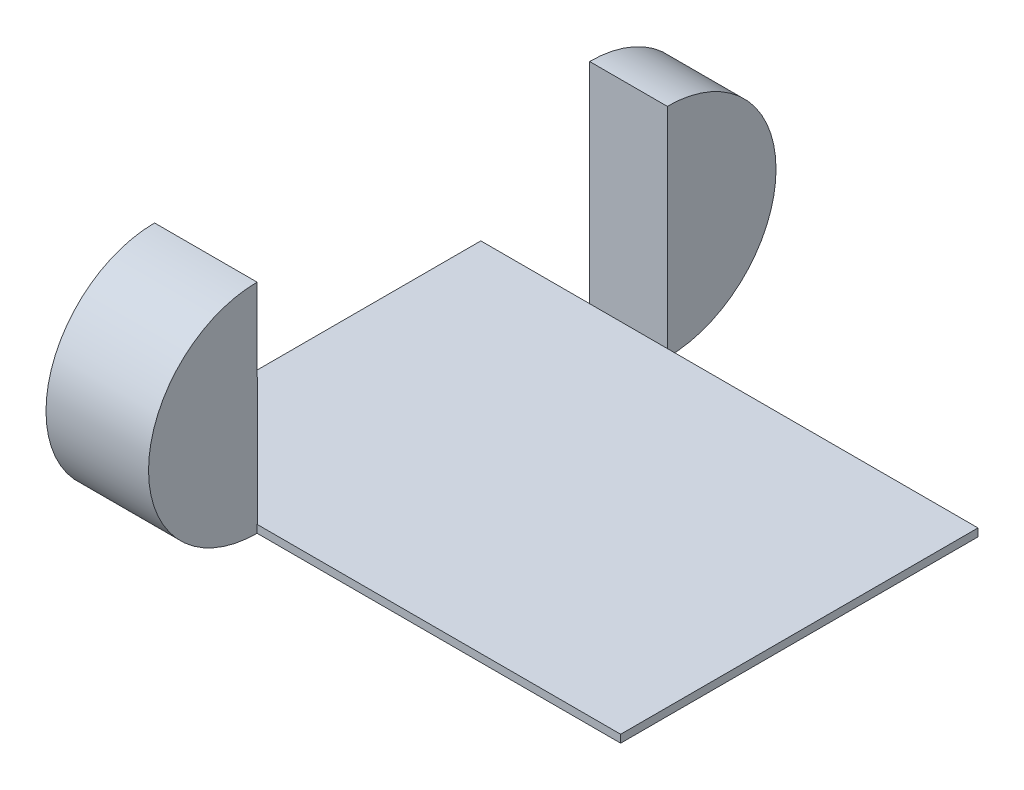
ISO-10303-21;
HEADER;
FILE_DESCRIPTION(('STEP AP214'),'2;1');
FILE_NAME('part.step','',(''),(''),'','','');
FILE_SCHEMA(('AUTOMOTIVE_DESIGN { 1 0 10303 214 1 1 1 1 }'));
ENDSEC;
DATA;
#1=APPLICATION_CONTEXT('core data for automotive mechanical design processes');
#2=APPLICATION_PROTOCOL_DEFINITION('international standard','automotive_design',2000,#1);
#3=PRODUCT_CONTEXT('',#1,'mechanical');
#4=PRODUCT('Part','Part','',(#3));
#5=PRODUCT_RELATED_PRODUCT_CATEGORY('part','',(#4));
#6=PRODUCT_DEFINITION_FORMATION('','',#4);
#7=PRODUCT_DEFINITION_CONTEXT('part definition',#1,'design');
#8=PRODUCT_DEFINITION('design','',#6,#7);
#9=PRODUCT_DEFINITION_SHAPE('','',#8);
#10=(LENGTH_UNIT() NAMED_UNIT(*) SI_UNIT(.MILLI.,.METRE.));
#11=(NAMED_UNIT(*) PLANE_ANGLE_UNIT() SI_UNIT($,.RADIAN.));
#12=(NAMED_UNIT(*) SI_UNIT($,.STERADIAN.) SOLID_ANGLE_UNIT());
#13=UNCERTAINTY_MEASURE_WITH_UNIT(LENGTH_MEASURE(1.E-05),#10,'distance_accuracy_value','');
#14=(GEOMETRIC_REPRESENTATION_CONTEXT(3) GLOBAL_UNCERTAINTY_ASSIGNED_CONTEXT((#13)) GLOBAL_UNIT_ASSIGNED_CONTEXT((#10,
#11,#12)) REPRESENTATION_CONTEXT('',''));
#15=CARTESIAN_POINT('',(0.,0.,0.));
#16=DIRECTION('',(0.,0.,1.));
#17=DIRECTION('',(1.,0.,0.));
#18=AXIS2_PLACEMENT_3D('',#15,#16,#17);
#19=CARTESIAN_POINT('',(-16.,0.5,11.5));
#20=DIRECTION('',(0.,0.,-1.));
#21=DIRECTION('',(-1.,0.,0.));
#22=AXIS2_PLACEMENT_3D('',#19,#20,#21);
#23=PLANE('',#22);
#24=DIRECTION('',(0.,1.,0.));
#25=VECTOR('',#24,1.);
#26=CARTESIAN_POINT('',(-7.39999999999999,0.5,11.5));
#27=LINE('',#26,#25);
#28=CARTESIAN_POINT('',(-7.39999999999999,0.,11.4999999999998));
#29=VERTEX_POINT('',#28);
#30=CARTESIAN_POINT('',(-7.39999999999999,0.5,11.5));
#31=VERTEX_POINT('',#30);
#32=EDGE_CURVE('E168',#29,#31,#27,.T.);
#33=ORIENTED_EDGE('',*,*,#32,.F.);
#34=DIRECTION('',(1.,0.,0.));
#35=VECTOR('',#34,1.);
#36=CARTESIAN_POINT('',(-16.,0.,11.5));
#37=LINE('',#36,#35);
#38=CARTESIAN_POINT('',(16.,0.,11.5));
#39=VERTEX_POINT('',#38);
#40=EDGE_CURVE('E41',#29,#39,#37,.T.);
#41=ORIENTED_EDGE('',*,*,#40,.T.);
#42=DIRECTION('',(0.,-1.,0.));
#43=VECTOR('',#42,1.);
#44=CARTESIAN_POINT('',(16.,0.5,11.5));
#45=LINE('',#44,#43);
#46=CARTESIAN_POINT('',(16.,0.5,11.5));
#47=VERTEX_POINT('',#46);
#48=EDGE_CURVE('E230',#47,#39,#45,.T.);
#49=ORIENTED_EDGE('',*,*,#48,.F.);
#50=DIRECTION('',(1.,0.,0.));
#51=VECTOR('',#50,1.);
#52=CARTESIAN_POINT('',(-16.,0.5,11.5));
#53=LINE('',#52,#51);
#54=EDGE_CURVE('E226',#31,#47,#53,.T.);
#55=ORIENTED_EDGE('',*,*,#54,.F.);
#56=EDGE_LOOP('',(#33,#41,#49,#55));
#57=FACE_BOUND('',#56,.T.);
#58=ADVANCED_FACE('F37',(#57),#23,.F.);
#59=CARTESIAN_POINT('',(0.,0.5,0.));
#60=DIRECTION('',(0.,1.,0.));
#61=DIRECTION('',(0.,0.,1.));
#62=AXIS2_PLACEMENT_3D('',#59,#60,#61);
#63=PLANE('',#62);
#64=DIRECTION('',(-1.,0.,0.));
#65=VECTOR('',#64,1.);
#66=CARTESIAN_POINT('',(0.,0.5,11.4742724279794));
#67=LINE('',#66,#65);
#68=CARTESIAN_POINT('',(-7.39999999999999,0.5,11.4742724279794));
#69=VERTEX_POINT('',#68);
#70=CARTESIAN_POINT('',(-14.,0.5,11.4742724279794));
#71=VERTEX_POINT('',#70);
#72=EDGE_CURVE('E205',#69,#71,#67,.T.);
#73=ORIENTED_EDGE('',*,*,#72,.F.);
#74=DIRECTION('',(0.,0.,1.));
#75=VECTOR('',#74,1.);
#76=CARTESIAN_POINT('',(-7.4,0.5,0.));
#77=LINE('',#76,#75);
#78=EDGE_CURVE('E148',#69,#31,#77,.T.);
#79=ORIENTED_EDGE('',*,*,#78,.T.);
#80=ORIENTED_EDGE('',*,*,#54,.T.);
#81=DIRECTION('',(0.,0.,-1.));
#82=VECTOR('',#81,1.);
#83=CARTESIAN_POINT('',(16.,0.5,-11.5));
#84=LINE('',#83,#82);
#85=CARTESIAN_POINT('',(16.,0.5,-11.5));
#86=VERTEX_POINT('',#85);
#87=EDGE_CURVE('E217',#47,#86,#84,.T.);
#88=ORIENTED_EDGE('',*,*,#87,.T.);
#89=DIRECTION('',(-1.,0.,0.));
#90=VECTOR('',#89,1.);
#91=CARTESIAN_POINT('',(-16.,0.5,-11.5));
#92=LINE('',#91,#90);
#93=CARTESIAN_POINT('',(-4.,0.5,-11.5));
#94=VERTEX_POINT('',#93);
#95=EDGE_CURVE('E221',#86,#94,#92,.T.);
#96=ORIENTED_EDGE('',*,*,#95,.T.);
#97=DIRECTION('',(1.,0.,0.));
#98=VECTOR('',#97,1.);
#99=CARTESIAN_POINT('',(0.,0.5,-11.5));
#100=LINE('',#99,#98);
#101=CARTESIAN_POINT('',(-9.,0.5,-11.5));
#102=VERTEX_POINT('',#101);
#103=EDGE_CURVE('E211',#102,#94,#100,.T.);
#104=ORIENTED_EDGE('',*,*,#103,.F.);
#105=CARTESIAN_POINT('',(-16.,0.5,-11.5));
#106=VERTEX_POINT('',#105);
#107=EDGE_CURVE('E62',#102,#106,#92,.T.);
#108=ORIENTED_EDGE('',*,*,#107,.T.);
#109=DIRECTION('',(0.,0.,1.));
#110=VECTOR('',#109,1.);
#111=CARTESIAN_POINT('',(-16.,0.5,-11.5));
#112=LINE('',#111,#110);
#113=CARTESIAN_POINT('',(-16.,0.5,11.5));
#114=VERTEX_POINT('',#113);
#115=EDGE_CURVE('E224',#106,#114,#112,.T.);
#116=ORIENTED_EDGE('',*,*,#115,.T.);
#117=CARTESIAN_POINT('',(-14.,0.5,11.5));
#118=VERTEX_POINT('',#117);
#119=EDGE_CURVE('E227',#114,#118,#53,.T.);
#120=ORIENTED_EDGE('',*,*,#119,.T.);
#121=DIRECTION('',(0.,0.,1.));
#122=VECTOR('',#121,1.);
#123=CARTESIAN_POINT('',(-14.,0.5,0.));
#124=LINE('',#123,#122);
#125=EDGE_CURVE('E294',#71,#118,#124,.T.);
#126=ORIENTED_EDGE('',*,*,#125,.F.);
#127=EDGE_LOOP('',(#73,#79,#80,#88,#96,#104,#108,#116,#120,#126));
#128=FACE_BOUND('',#127,.T.);
#129=ADVANCED_FACE('F266',(#128),#63,.T.);
#130=CARTESIAN_POINT('',(0.,0.,0.));
#131=DIRECTION('',(0.,1.,0.));
#132=DIRECTION('',(0.,0.,1.));
#133=AXIS2_PLACEMENT_3D('',#130,#131,#132);
#134=PLANE('',#133);
#135=CARTESIAN_POINT('',(-7.39999999999999,6.99998728845041,11.4866597765736));
#136=DIRECTION('',(-1.,0.,0.));
#137=DIRECTION('',(0.,-0.999998184064055,-0.0019057462037765));
#138=AXIS2_PLACEMENT_3D('',#135,#136,#137);
#139=CIRCLE('',#138,7.00000000000202);
#140=CARTESIAN_POINT('',(-7.39999999999999,0.,11.4733195531471));
#141=VERTEX_POINT('',#140);
#142=EDGE_CURVE('E11',#141,#29,#139,.T.);
#143=ORIENTED_EDGE('',*,*,#142,.F.);
#144=DIRECTION('',(-1.,0.,0.));
#145=VECTOR('',#144,1.);
#146=CARTESIAN_POINT('',(-7.39999999999999,0.,11.4733195531471));
#147=LINE('',#146,#145);
#148=CARTESIAN_POINT('',(-14.,0.,11.4733195531471));
#149=VERTEX_POINT('',#148);
#150=EDGE_CURVE('E144',#141,#149,#147,.T.);
#151=ORIENTED_EDGE('',*,*,#150,.T.);
#152=CARTESIAN_POINT('',(-14.,0.,11.4733195531471));
#153=DIRECTION('',(0.,0.,1.));
#154=VECTOR('',#153,1.);
#155=LINE('',#152,#154);
#156=CARTESIAN_POINT('',(-14.,0.,11.5));
#157=VERTEX_POINT('',#156);
#158=EDGE_CURVE('E47',#149,#157,#155,.T.);
#159=ORIENTED_EDGE('',*,*,#158,.T.);
#160=CARTESIAN_POINT('',(-16.,0.,11.5));
#161=VERTEX_POINT('',#160);
#162=EDGE_CURVE('E220',#161,#157,#37,.T.);
#163=ORIENTED_EDGE('',*,*,#162,.F.);
#164=DIRECTION('',(0.,0.,1.));
#165=VECTOR('',#164,1.);
#166=CARTESIAN_POINT('',(-16.,0.,-11.5));
#167=LINE('',#166,#165);
#168=CARTESIAN_POINT('',(-16.,0.,-11.5));
#169=VERTEX_POINT('',#168);
#170=EDGE_CURVE('E237',#169,#161,#167,.T.);
#171=ORIENTED_EDGE('',*,*,#170,.F.);
#172=DIRECTION('',(-1.,0.,0.));
#173=VECTOR('',#172,1.);
#174=CARTESIAN_POINT('',(-16.,0.,-11.5));
#175=LINE('',#174,#173);
#176=CARTESIAN_POINT('',(-9.,0.,-11.5));
#177=VERTEX_POINT('',#176);
#178=EDGE_CURVE('E233',#177,#169,#175,.T.);
#179=ORIENTED_EDGE('',*,*,#178,.F.);
#180=DIRECTION('',(-1.,0.,0.));
#181=VECTOR('',#180,1.);
#182=CARTESIAN_POINT('',(-4.,0.,-11.5));
#183=LINE('',#182,#181);
#184=CARTESIAN_POINT('',(-4.,0.,-11.5));
#185=VERTEX_POINT('',#184);
#186=EDGE_CURVE('E200',#185,#177,#183,.T.);
#187=ORIENTED_EDGE('',*,*,#186,.F.);
#188=CARTESIAN_POINT('',(16.,0.,-11.5));
#189=VERTEX_POINT('',#188);
#190=EDGE_CURVE('E234',#189,#185,#175,.T.);
#191=ORIENTED_EDGE('',*,*,#190,.F.);
#192=DIRECTION('',(0.,0.,-1.));
#193=VECTOR('',#192,1.);
#194=CARTESIAN_POINT('',(16.,0.,-11.5));
#195=LINE('',#194,#193);
#196=EDGE_CURVE('E216',#39,#189,#195,.T.);
#197=ORIENTED_EDGE('',*,*,#196,.F.);
#198=ORIENTED_EDGE('',*,*,#40,.F.);
#199=EDGE_LOOP('',(#143,#151,#159,#163,#171,#179,#187,#191,#197,#198));
#200=FACE_BOUND('',#199,.T.);
#201=ADVANCED_FACE('F255',(#200),#134,.F.);
#202=CARTESIAN_POINT('',(-16.,0.5,-11.5));
#203=DIRECTION('',(0.,0.,1.));
#204=DIRECTION('',(1.,0.,0.));
#205=AXIS2_PLACEMENT_3D('',#202,#203,#204);
#206=PLANE('',#205);
#207=DIRECTION('',(0.,1.,0.));
#208=VECTOR('',#207,1.);
#209=CARTESIAN_POINT('',(-4.,0.,-11.5));
#210=LINE('',#209,#208);
#211=EDGE_CURVE('E198',#185,#94,#210,.T.);
#212=ORIENTED_EDGE('',*,*,#211,.T.);
#213=ORIENTED_EDGE('',*,*,#95,.F.);
#214=DIRECTION('',(0.,-1.,0.));
#215=VECTOR('',#214,1.);
#216=CARTESIAN_POINT('',(16.,0.5,-11.5));
#217=LINE('',#216,#215);
#218=EDGE_CURVE('E299',#86,#189,#217,.T.);
#219=ORIENTED_EDGE('',*,*,#218,.T.);
#220=ORIENTED_EDGE('',*,*,#190,.T.);
#221=EDGE_LOOP('',(#212,#213,#219,#220));
#222=FACE_BOUND('',#221,.T.);
#223=ADVANCED_FACE('F265',(#222),#206,.F.);
#224=CARTESIAN_POINT('',(16.,0.5,-11.5));
#225=DIRECTION('',(-1.,0.,0.));
#226=DIRECTION('',(0.,0.,1.));
#227=AXIS2_PLACEMENT_3D('',#224,#225,#226);
#228=PLANE('',#227);
#229=ORIENTED_EDGE('',*,*,#196,.T.);
#230=ORIENTED_EDGE('',*,*,#218,.F.);
#231=ORIENTED_EDGE('',*,*,#87,.F.);
#232=ORIENTED_EDGE('',*,*,#48,.T.);
#233=EDGE_LOOP('',(#229,#230,#231,#232));
#234=FACE_BOUND('',#233,.T.);
#235=ADVANCED_FACE('F39',(#234),#228,.F.);
#236=ORIENTED_EDGE('',*,*,#107,.F.);
#237=DIRECTION('',(0.,1.,0.));
#238=VECTOR('',#237,1.);
#239=CARTESIAN_POINT('',(-9.,0.,-11.5));
#240=LINE('',#239,#238);
#241=EDGE_CURVE('E197',#177,#102,#240,.T.);
#242=ORIENTED_EDGE('',*,*,#241,.F.);
#243=ORIENTED_EDGE('',*,*,#178,.T.);
#244=DIRECTION('',(0.,-1.,0.));
#245=VECTOR('',#244,1.);
#246=CARTESIAN_POINT('',(-16.,0.5,-11.5));
#247=LINE('',#246,#245);
#248=EDGE_CURVE('E302',#106,#169,#247,.T.);
#249=ORIENTED_EDGE('',*,*,#248,.F.);
#250=EDGE_LOOP('',(#236,#242,#243,#249));
#251=FACE_BOUND('',#250,.T.);
#252=ADVANCED_FACE('F276',(#251),#206,.F.);
#253=CARTESIAN_POINT('',(-16.,0.5,-11.5));
#254=DIRECTION('',(1.,0.,0.));
#255=DIRECTION('',(0.,0.,-1.));
#256=AXIS2_PLACEMENT_3D('',#253,#254,#255);
#257=PLANE('',#256);
#258=ORIENTED_EDGE('',*,*,#170,.T.);
#259=DIRECTION('',(0.,-1.,0.));
#260=VECTOR('',#259,1.);
#261=CARTESIAN_POINT('',(-16.,0.5,11.5));
#262=LINE('',#261,#260);
#263=EDGE_CURVE('E300',#114,#161,#262,.T.);
#264=ORIENTED_EDGE('',*,*,#263,.F.);
#265=ORIENTED_EDGE('',*,*,#115,.F.);
#266=ORIENTED_EDGE('',*,*,#248,.T.);
#267=EDGE_LOOP('',(#258,#264,#265,#266));
#268=FACE_BOUND('',#267,.T.);
#269=ADVANCED_FACE('F273',(#268),#257,.F.);
#270=ORIENTED_EDGE('',*,*,#162,.T.);
#271=DIRECTION('',(0.,1.,0.));
#272=VECTOR('',#271,1.);
#273=CARTESIAN_POINT('',(-14.,0.5,11.5));
#274=LINE('',#273,#272);
#275=EDGE_CURVE('E158',#157,#118,#274,.T.);
#276=ORIENTED_EDGE('',*,*,#275,.T.);
#277=ORIENTED_EDGE('',*,*,#119,.F.);
#278=ORIENTED_EDGE('',*,*,#263,.T.);
#279=EDGE_LOOP('',(#270,#276,#277,#278));
#280=FACE_BOUND('',#279,.T.);
#281=ADVANCED_FACE('F268',(#280),#23,.F.);
#282=CARTESIAN_POINT('',(-4.,7.,-11.5));
#283=DIRECTION('',(-1.,0.,0.));
#284=DIRECTION('',(0.,0.,1.));
#285=AXIS2_PLACEMENT_3D('',#282,#283,#284);
#286=CYLINDRICAL_SURFACE('',#285,7.);
#287=CARTESIAN_POINT('',(-9.,7.,-11.5));
#288=DIRECTION('',(-1.,0.,0.));
#289=DIRECTION('',(0.,0.,1.));
#290=AXIS2_PLACEMENT_3D('',#287,#288,#289);
#291=CIRCLE('',#290,7.);
#292=CARTESIAN_POINT('',(-9.,14.,-11.5));
#293=VERTEX_POINT('',#292);
#294=EDGE_CURVE('E201',#293,#177,#291,.T.);
#295=ORIENTED_EDGE('',*,*,#294,.F.);
#296=DIRECTION('',(-1.,0.,0.));
#297=VECTOR('',#296,1.);
#298=CARTESIAN_POINT('',(-4.,14.,-11.5));
#299=LINE('',#298,#297);
#300=CARTESIAN_POINT('',(-4.,14.,-11.5));
#301=VERTEX_POINT('',#300);
#302=EDGE_CURVE('E208',#301,#293,#299,.T.);
#303=ORIENTED_EDGE('',*,*,#302,.F.);
#304=CARTESIAN_POINT('',(-4.,7.,-11.5));
#305=DIRECTION('',(-1.,0.,0.));
#306=DIRECTION('',(0.,0.,1.));
#307=AXIS2_PLACEMENT_3D('',#304,#305,#306);
#308=CIRCLE('',#307,7.);
#309=EDGE_CURVE('E188',#301,#185,#308,.T.);
#310=ORIENTED_EDGE('',*,*,#309,.T.);
#311=ORIENTED_EDGE('',*,*,#186,.T.);
#312=EDGE_LOOP('',(#295,#303,#310,#311));
#313=FACE_BOUND('',#312,.T.);
#314=ADVANCED_FACE('F272',(#313),#286,.T.);
#315=CARTESIAN_POINT('',(-4.,0.,-11.5));
#316=DIRECTION('',(0.,0.,1.));
#317=DIRECTION('',(1.,0.,0.));
#318=AXIS2_PLACEMENT_3D('',#315,#316,#317);
#319=PLANE('',#318);
#320=EDGE_CURVE('E204',#102,#293,#240,.T.);
#321=ORIENTED_EDGE('',*,*,#320,.F.);
#322=ORIENTED_EDGE('',*,*,#103,.T.);
#323=EDGE_CURVE('E196',#94,#301,#210,.T.);
#324=ORIENTED_EDGE('',*,*,#323,.T.);
#325=ORIENTED_EDGE('',*,*,#302,.T.);
#326=EDGE_LOOP('',(#321,#322,#324,#325));
#327=FACE_BOUND('',#326,.T.);
#328=ADVANCED_FACE('F323',(#327),#319,.T.);
#329=CARTESIAN_POINT('',(-4.,7.,-11.5));
#330=DIRECTION('',(-1.,0.,0.));
#331=DIRECTION('',(0.,0.,1.));
#332=AXIS2_PLACEMENT_3D('',#329,#330,#331);
#333=PLANE('',#332);
#334=ORIENTED_EDGE('',*,*,#309,.F.);
#335=ORIENTED_EDGE('',*,*,#323,.F.);
#336=ORIENTED_EDGE('',*,*,#211,.F.);
#337=EDGE_LOOP('',(#334,#335,#336));
#338=FACE_BOUND('',#337,.T.);
#339=ADVANCED_FACE('F181',(#338),#333,.F.);
#340=CARTESIAN_POINT('',(-9.,7.,-11.5));
#341=DIRECTION('',(-1.,0.,0.));
#342=DIRECTION('',(0.,0.,1.));
#343=AXIS2_PLACEMENT_3D('',#340,#341,#342);
#344=PLANE('',#343);
#345=ORIENTED_EDGE('',*,*,#294,.T.);
#346=ORIENTED_EDGE('',*,*,#241,.T.);
#347=ORIENTED_EDGE('',*,*,#320,.T.);
#348=EDGE_LOOP('',(#345,#346,#347));
#349=FACE_BOUND('',#348,.T.);
#350=ADVANCED_FACE('F179',(#349),#344,.T.);
#351=CARTESIAN_POINT('',(-7.39999999999999,6.99998728845041,11.4866597765736));
#352=DIRECTION('',(-1.,0.,0.));
#353=DIRECTION('',(0.,0.,1.));
#354=AXIS2_PLACEMENT_3D('',#351,#352,#353);
#355=CYLINDRICAL_SURFACE('',#354,7.00000000000202);
#356=ORIENTED_EDGE('',*,*,#142,.T.);
#357=CARTESIAN_POINT('',(-7.39999999999999,6.99998728845041,11.4866597765736));
#358=DIRECTION('',(-1.,0.,0.));
#359=DIRECTION('',(0.,0.,1.));
#360=AXIS2_PLACEMENT_3D('',#357,#358,#359);
#361=CIRCLE('',#360,7.00000000000202);
#362=CARTESIAN_POINT('',(-7.39999999999999,13.9999745769008,11.5));
#363=VERTEX_POINT('',#362);
#364=EDGE_CURVE('E126',#29,#363,#361,.T.);
#365=ORIENTED_EDGE('',*,*,#364,.T.);
#366=DIRECTION('',(-1.,0.,0.));
#367=VECTOR('',#366,1.);
#368=CARTESIAN_POINT('',(-7.39999999999999,13.9999745769008,11.5));
#369=LINE('',#368,#367);
#370=CARTESIAN_POINT('',(-14.,13.9999745769008,11.5));
#371=VERTEX_POINT('',#370);
#372=EDGE_CURVE('E129',#363,#371,#369,.T.);
#373=ORIENTED_EDGE('',*,*,#372,.T.);
#374=CARTESIAN_POINT('',(-14.,6.99998728845041,11.4866597765736));
#375=DIRECTION('',(-1.,0.,0.));
#376=DIRECTION('',(0.,0.,1.));
#377=AXIS2_PLACEMENT_3D('',#374,#375,#376);
#378=CIRCLE('',#377,7.00000000000202);
#379=EDGE_CURVE('E54',#157,#371,#378,.T.);
#380=ORIENTED_EDGE('',*,*,#379,.F.);
#381=ORIENTED_EDGE('',*,*,#158,.F.);
#382=ORIENTED_EDGE('',*,*,#150,.F.);
#383=EDGE_LOOP('',(#356,#365,#373,#380,#381,#382));
#384=FACE_BOUND('',#383,.T.);
#385=ADVANCED_FACE('F128',(#384),#355,.T.);
#386=CARTESIAN_POINT('',(-7.39999999999999,0.,11.4733195531471));
#387=DIRECTION('',(0.,0.00190574620377638,-0.999998184064055));
#388=DIRECTION('',(0.,0.999998184064055,0.00190574620377638));
#389=AXIS2_PLACEMENT_3D('',#386,#387,#388);
#390=PLANE('',#389);
#391=DIRECTION('',(0.,-0.999998184064055,-0.00190574620377638));
#392=VECTOR('',#391,1.);
#393=CARTESIAN_POINT('',(-7.39999999999999,0.,11.4733195531471));
#394=LINE('',#393,#392);
#395=EDGE_CURVE('E136',#363,#69,#394,.T.);
#396=ORIENTED_EDGE('',*,*,#395,.T.);
#397=ORIENTED_EDGE('',*,*,#72,.T.);
#398=DIRECTION('',(0.,-0.999998184064055,-0.00190574620377638));
#399=VECTOR('',#398,1.);
#400=CARTESIAN_POINT('',(-14.,0.,11.4733195531471));
#401=LINE('',#400,#399);
#402=EDGE_CURVE('E137',#371,#71,#401,.T.);
#403=ORIENTED_EDGE('',*,*,#402,.F.);
#404=ORIENTED_EDGE('',*,*,#372,.F.);
#405=EDGE_LOOP('',(#396,#397,#403,#404));
#406=FACE_BOUND('',#405,.T.);
#407=ADVANCED_FACE('F141',(#406),#390,.T.);
#408=CARTESIAN_POINT('',(-7.39999999999999,6.99998728845041,11.4866597765736));
#409=DIRECTION('',(-1.,0.,0.));
#410=DIRECTION('',(0.,0.,1.));
#411=AXIS2_PLACEMENT_3D('',#408,#409,#410);
#412=PLANE('',#411);
#413=ORIENTED_EDGE('',*,*,#78,.F.);
#414=ORIENTED_EDGE('',*,*,#395,.F.);
#415=ORIENTED_EDGE('',*,*,#364,.F.);
#416=ORIENTED_EDGE('',*,*,#32,.T.);
#417=EDGE_LOOP('',(#413,#414,#415,#416));
#418=FACE_BOUND('',#417,.T.);
#419=ADVANCED_FACE('F146',(#418),#412,.F.);
#420=CARTESIAN_POINT('',(-14.,6.99998728845041,11.4866597765736));
#421=DIRECTION('',(-1.,0.,0.));
#422=DIRECTION('',(0.,0.,1.));
#423=AXIS2_PLACEMENT_3D('',#420,#421,#422);
#424=PLANE('',#423);
#425=ORIENTED_EDGE('',*,*,#402,.T.);
#426=ORIENTED_EDGE('',*,*,#125,.T.);
#427=ORIENTED_EDGE('',*,*,#275,.F.);
#428=ORIENTED_EDGE('',*,*,#379,.T.);
#429=EDGE_LOOP('',(#425,#426,#427,#428));
#430=FACE_BOUND('',#429,.T.);
#431=ADVANCED_FACE('F331',(#430),#424,.T.);
#432=CLOSED_SHELL('',(#58,#129,#201,#223,#235,#252,#269,#281,#314,#328,#339,#350,#385,#407,#419,#431));
#433=MANIFOLD_SOLID_BREP('B2',#432);
#434=ADVANCED_BREP_SHAPE_REPRESENTATION('',(#18,#433),#14);
#435=SHAPE_DEFINITION_REPRESENTATION(#9,#434);
ENDSEC;
END-ISO-10303-21;
